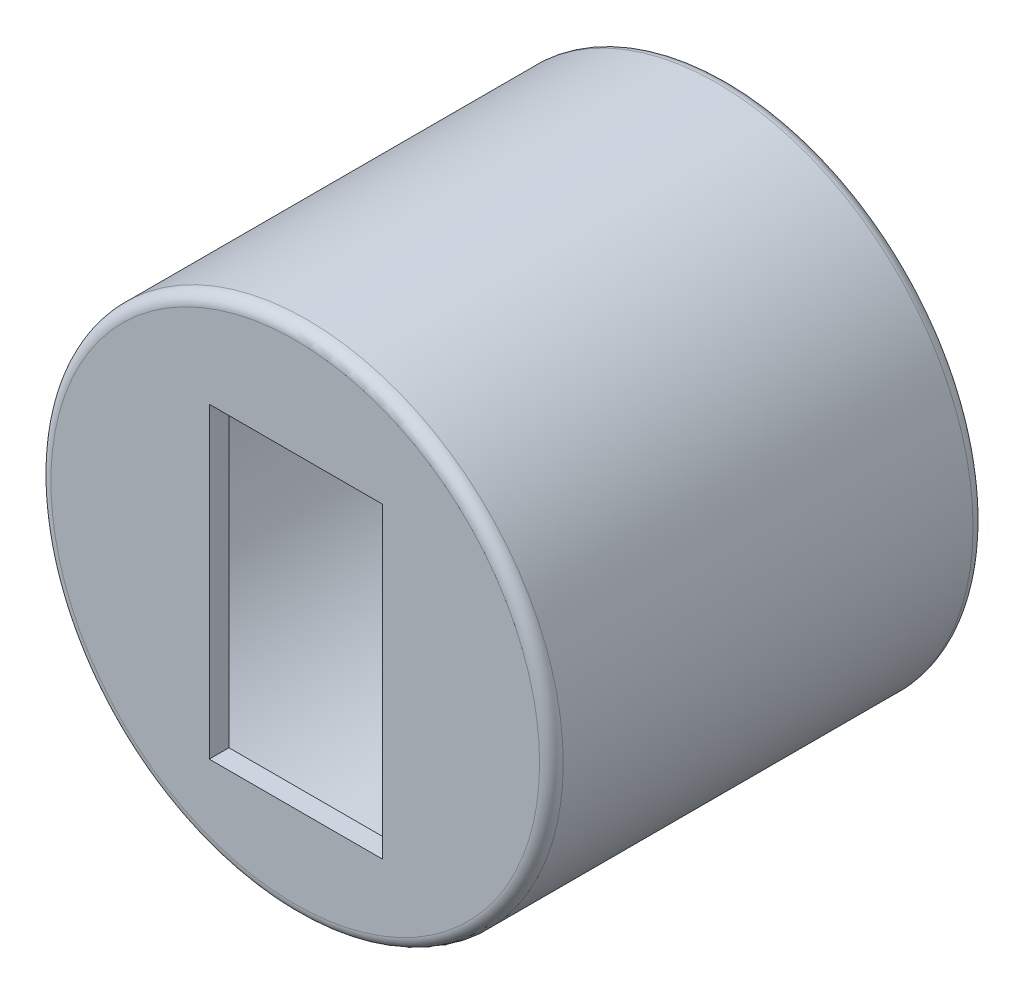
ISO-10303-21;
HEADER;
FILE_DESCRIPTION(('STEP AP214'),'2;1');
FILE_NAME('part.step','',(''),(''),'','','');
FILE_SCHEMA(('AUTOMOTIVE_DESIGN { 1 0 10303 214 1 1 1 1 }'));
ENDSEC;
DATA;
#1=APPLICATION_CONTEXT('core data for automotive mechanical design processes');
#2=APPLICATION_PROTOCOL_DEFINITION('international standard','automotive_design',2000,#1);
#3=PRODUCT_CONTEXT('',#1,'mechanical');
#4=PRODUCT('Part','Part','',(#3));
#5=PRODUCT_RELATED_PRODUCT_CATEGORY('part','',(#4));
#6=PRODUCT_DEFINITION_FORMATION('','',#4);
#7=PRODUCT_DEFINITION_CONTEXT('part definition',#1,'design');
#8=PRODUCT_DEFINITION('design','',#6,#7);
#9=PRODUCT_DEFINITION_SHAPE('','',#8);
#10=(LENGTH_UNIT() NAMED_UNIT(*) SI_UNIT(.MILLI.,.METRE.));
#11=(NAMED_UNIT(*) PLANE_ANGLE_UNIT() SI_UNIT($,.RADIAN.));
#12=(NAMED_UNIT(*) SI_UNIT($,.STERADIAN.) SOLID_ANGLE_UNIT());
#13=UNCERTAINTY_MEASURE_WITH_UNIT(LENGTH_MEASURE(1.E-05),#10,'distance_accuracy_value','');
#14=(GEOMETRIC_REPRESENTATION_CONTEXT(3) GLOBAL_UNCERTAINTY_ASSIGNED_CONTEXT((#13)) GLOBAL_UNIT_ASSIGNED_CONTEXT((#10,
#11,#12)) REPRESENTATION_CONTEXT('',''));
#15=CARTESIAN_POINT('',(0.,0.,0.));
#16=DIRECTION('',(0.,0.,1.));
#17=DIRECTION('',(1.,0.,0.));
#18=AXIS2_PLACEMENT_3D('',#15,#16,#17);
#19=CARTESIAN_POINT('',(0.,0.,10.));
#20=DIRECTION('',(0.,0.,-1.));
#21=DIRECTION('',(-1.,0.,0.));
#22=AXIS2_PLACEMENT_3D('',#19,#20,#21);
#23=CYLINDRICAL_SURFACE('',#22,6.5);
#24=CARTESIAN_POINT('',(0.,0.,-0.200000000000001));
#25=DIRECTION('',(0.,0.,-1.));
#26=DIRECTION('',(-1.,0.,0.));
#27=AXIS2_PLACEMENT_3D('',#24,#25,#26);
#28=CIRCLE('',#27,6.5);
#29=CARTESIAN_POINT('',(-6.5,0.,-0.200000000000001));
#30=VERTEX_POINT('',#29);
#31=EDGE_CURVE('E54',#30,#30,#28,.F.);
#32=ORIENTED_EDGE('',*,*,#31,.T.);
#33=EDGE_LOOP('',(#32));
#34=FACE_BOUND('',#33,.T.);
#35=CARTESIAN_POINT('',(0.,0.,10.2));
#36=DIRECTION('',(0.,0.,1.));
#37=DIRECTION('',(1.,0.,0.));
#38=AXIS2_PLACEMENT_3D('',#35,#36,#37);
#39=CIRCLE('',#38,6.5);
#40=CARTESIAN_POINT('',(6.5,0.,10.2));
#41=VERTEX_POINT('',#40);
#42=EDGE_CURVE('E269',#41,#41,#39,.F.);
#43=ORIENTED_EDGE('',*,*,#42,.T.);
#44=EDGE_LOOP('',(#43));
#45=FACE_BOUND('',#44,.T.);
#46=ADVANCED_FACE('F45',(#34,#45),#23,.T.);
#47=CARTESIAN_POINT('',(0.,0.,-0.5));
#48=DIRECTION('',(0.,0.,-1.));
#49=DIRECTION('',(-1.,0.,0.));
#50=AXIS2_PLACEMENT_3D('',#47,#48,#49);
#51=PLANE('',#50);
#52=CARTESIAN_POINT('',(0.,0.,-0.5));
#53=DIRECTION('',(0.,0.,-1.));
#54=DIRECTION('',(-1.,0.,0.));
#55=AXIS2_PLACEMENT_3D('',#52,#53,#54);
#56=CIRCLE('',#55,6.2);
#57=CARTESIAN_POINT('',(-6.2,0.,-0.5));
#58=VERTEX_POINT('',#57);
#59=EDGE_CURVE('E265',#58,#58,#56,.T.);
#60=ORIENTED_EDGE('',*,*,#59,.T.);
#61=EDGE_LOOP('',(#60));
#62=FACE_BOUND('',#61,.T.);
#63=DIRECTION('',(0.,1.,0.));
#64=VECTOR('',#63,1.);
#65=CARTESIAN_POINT('',(-1.45,1.8,-0.5));
#66=LINE('',#65,#64);
#67=CARTESIAN_POINT('',(-1.45,-1.7,-0.5));
#68=VERTEX_POINT('',#67);
#69=CARTESIAN_POINT('',(-1.45,1.7,-0.5));
#70=VERTEX_POINT('',#69);
#71=EDGE_CURVE('E291',#68,#70,#66,.T.);
#72=ORIENTED_EDGE('',*,*,#71,.F.);
#73=CARTESIAN_POINT('',(-1.35,-1.7,-0.5));
#74=DIRECTION('',(0.,0.,-1.));
#75=DIRECTION('',(-1.,0.,0.));
#76=AXIS2_PLACEMENT_3D('',#73,#74,#75);
#77=CIRCLE('',#76,0.1);
#78=CARTESIAN_POINT('',(-1.35,-1.8,-0.5));
#79=VERTEX_POINT('',#78);
#80=EDGE_CURVE('E242',#68,#79,#77,.F.);
#81=ORIENTED_EDGE('',*,*,#80,.T.);
#82=DIRECTION('',(-1.,0.,0.));
#83=VECTOR('',#82,1.);
#84=CARTESIAN_POINT('',(1.45,-1.8,-0.5));
#85=LINE('',#84,#83);
#86=CARTESIAN_POINT('',(1.35,-1.8,-0.5));
#87=VERTEX_POINT('',#86);
#88=EDGE_CURVE('E177',#87,#79,#85,.T.);
#89=ORIENTED_EDGE('',*,*,#88,.F.);
#90=CARTESIAN_POINT('',(1.35,-1.7,-0.5));
#91=DIRECTION('',(0.,0.,-1.));
#92=DIRECTION('',(-1.,0.,0.));
#93=AXIS2_PLACEMENT_3D('',#90,#91,#92);
#94=CIRCLE('',#93,0.1);
#95=CARTESIAN_POINT('',(1.45,-1.7,-0.5));
#96=VERTEX_POINT('',#95);
#97=EDGE_CURVE('E248',#87,#96,#94,.F.);
#98=ORIENTED_EDGE('',*,*,#97,.T.);
#99=DIRECTION('',(0.,-1.,0.));
#100=VECTOR('',#99,1.);
#101=CARTESIAN_POINT('',(1.45,1.8,-0.5));
#102=LINE('',#101,#100);
#103=CARTESIAN_POINT('',(1.45,1.7,-0.5));
#104=VERTEX_POINT('',#103);
#105=EDGE_CURVE('E301',#104,#96,#102,.T.);
#106=ORIENTED_EDGE('',*,*,#105,.F.);
#107=CARTESIAN_POINT('',(1.35,1.7,-0.5));
#108=DIRECTION('',(0.,0.,-1.));
#109=DIRECTION('',(-1.,0.,0.));
#110=AXIS2_PLACEMENT_3D('',#107,#108,#109);
#111=CIRCLE('',#110,0.1);
#112=CARTESIAN_POINT('',(1.35,1.8,-0.5));
#113=VERTEX_POINT('',#112);
#114=EDGE_CURVE('E254',#104,#113,#111,.F.);
#115=ORIENTED_EDGE('',*,*,#114,.T.);
#116=DIRECTION('',(1.,0.,0.));
#117=VECTOR('',#116,1.);
#118=CARTESIAN_POINT('',(1.45,1.8,-0.5));
#119=LINE('',#118,#117);
#120=CARTESIAN_POINT('',(-1.35,1.8,-0.5));
#121=VERTEX_POINT('',#120);
#122=EDGE_CURVE('E298',#121,#113,#119,.T.);
#123=ORIENTED_EDGE('',*,*,#122,.F.);
#124=CARTESIAN_POINT('',(-1.35,1.7,-0.5));
#125=DIRECTION('',(0.,0.,-1.));
#126=DIRECTION('',(-1.,0.,0.));
#127=AXIS2_PLACEMENT_3D('',#124,#125,#126);
#128=CIRCLE('',#127,0.1);
#129=EDGE_CURVE('E260',#121,#70,#128,.F.);
#130=ORIENTED_EDGE('',*,*,#129,.T.);
#131=EDGE_LOOP('',(#72,#81,#89,#98,#106,#115,#123,#130));
#132=FACE_BOUND('',#131,.T.);
#133=ADVANCED_FACE('F284',(#62,#132),#51,.T.);
#134=CARTESIAN_POINT('',(0.,0.,10.));
#135=DIRECTION('',(0.,0.,1.));
#136=DIRECTION('',(1.,0.,0.));
#137=AXIS2_PLACEMENT_3D('',#134,#135,#136);
#138=PLANE('',#137);
#139=DIRECTION('',(1.,0.,0.));
#140=VECTOR('',#139,1.);
#141=CARTESIAN_POINT('',(2.2181444068749,-4.1,10.));
#142=LINE('',#141,#140);
#143=CARTESIAN_POINT('',(-2.18185559312509,-4.1,10.));
#144=VERTEX_POINT('',#143);
#145=CARTESIAN_POINT('',(2.2181444068749,-4.1,10.));
#146=VERTEX_POINT('',#145);
#147=EDGE_CURVE('E174',#144,#146,#142,.T.);
#148=ORIENTED_EDGE('',*,*,#147,.T.);
#149=DIRECTION('',(0.,1.,0.));
#150=VECTOR('',#149,1.);
#151=CARTESIAN_POINT('',(2.2181444068749,3.7,10.));
#152=LINE('',#151,#150);
#153=CARTESIAN_POINT('',(2.2181444068749,3.7,10.));
#154=VERTEX_POINT('',#153);
#155=EDGE_CURVE('E156',#146,#154,#152,.T.);
#156=ORIENTED_EDGE('',*,*,#155,.T.);
#157=DIRECTION('',(-1.,0.,0.));
#158=VECTOR('',#157,1.);
#159=CARTESIAN_POINT('',(-2.1818555931251,3.7,10.));
#160=LINE('',#159,#158);
#161=CARTESIAN_POINT('',(-2.1818555931251,3.7,10.));
#162=VERTEX_POINT('',#161);
#163=EDGE_CURVE('E180',#154,#162,#160,.T.);
#164=ORIENTED_EDGE('',*,*,#163,.T.);
#165=DIRECTION('',(0.,-1.,0.));
#166=VECTOR('',#165,1.);
#167=CARTESIAN_POINT('',(-2.1818555931251,3.7,10.));
#168=LINE('',#167,#166);
#169=EDGE_CURVE('E150',#162,#144,#168,.T.);
#170=ORIENTED_EDGE('',*,*,#169,.T.);
#171=EDGE_LOOP('',(#148,#156,#164,#170));
#172=FACE_BOUND('',#171,.T.);
#173=CARTESIAN_POINT('',(0.,0.,10.));
#174=DIRECTION('',(0.,0.,1.));
#175=DIRECTION('',(1.,0.,0.));
#176=AXIS2_PLACEMENT_3D('',#173,#174,#175);
#177=CIRCLE('',#176,6.);
#178=CARTESIAN_POINT('',(6.,0.,10.));
#179=VERTEX_POINT('',#178);
#180=EDGE_CURVE('E158',#179,#179,#177,.T.);
#181=ORIENTED_EDGE('',*,*,#180,.F.);
#182=EDGE_LOOP('',(#181));
#183=FACE_BOUND('',#182,.T.);
#184=ADVANCED_FACE('F287',(#172,#183),#138,.F.);
#185=CARTESIAN_POINT('',(0.,0.,10.5));
#186=DIRECTION('',(0.,0.,1.));
#187=DIRECTION('',(1.,0.,0.));
#188=AXIS2_PLACEMENT_3D('',#185,#186,#187);
#189=PLANE('',#188);
#190=CARTESIAN_POINT('',(0.,0.,10.5));
#191=DIRECTION('',(0.,0.,1.));
#192=DIRECTION('',(1.,0.,0.));
#193=AXIS2_PLACEMENT_3D('',#190,#191,#192);
#194=CIRCLE('',#193,6.2);
#195=CARTESIAN_POINT('',(6.2,0.,10.5));
#196=VERTEX_POINT('',#195);
#197=EDGE_CURVE('E11',#196,#196,#194,.T.);
#198=ORIENTED_EDGE('',*,*,#197,.T.);
#199=EDGE_LOOP('',(#198));
#200=FACE_BOUND('',#199,.T.);
#201=DIRECTION('',(0.,1.,0.));
#202=VECTOR('',#201,1.);
#203=CARTESIAN_POINT('',(2.2181444068749,3.7,10.5));
#204=LINE('',#203,#202);
#205=CARTESIAN_POINT('',(2.2181444068749,-4.1,10.5));
#206=VERTEX_POINT('',#205);
#207=CARTESIAN_POINT('',(2.2181444068749,3.7,10.5));
#208=VERTEX_POINT('',#207);
#209=EDGE_CURVE('E149',#206,#208,#204,.T.);
#210=ORIENTED_EDGE('',*,*,#209,.F.);
#211=DIRECTION('',(1.,0.,0.));
#212=VECTOR('',#211,1.);
#213=CARTESIAN_POINT('',(2.2181444068749,-4.1,10.5));
#214=LINE('',#213,#212);
#215=CARTESIAN_POINT('',(-2.18185559312509,-4.1,10.5));
#216=VERTEX_POINT('',#215);
#217=EDGE_CURVE('E138',#216,#206,#214,.T.);
#218=ORIENTED_EDGE('',*,*,#217,.F.);
#219=DIRECTION('',(0.,-1.,0.));
#220=VECTOR('',#219,1.);
#221=CARTESIAN_POINT('',(-2.1818555931251,3.7,10.5));
#222=LINE('',#221,#220);
#223=CARTESIAN_POINT('',(-2.1818555931251,3.7,10.5));
#224=VERTEX_POINT('',#223);
#225=EDGE_CURVE('E168',#224,#216,#222,.T.);
#226=ORIENTED_EDGE('',*,*,#225,.F.);
#227=DIRECTION('',(-1.,0.,0.));
#228=VECTOR('',#227,1.);
#229=CARTESIAN_POINT('',(-2.1818555931251,3.7,10.5));
#230=LINE('',#229,#228);
#231=EDGE_CURVE('E164',#208,#224,#230,.T.);
#232=ORIENTED_EDGE('',*,*,#231,.F.);
#233=EDGE_LOOP('',(#210,#218,#226,#232));
#234=FACE_BOUND('',#233,.T.);
#235=ADVANCED_FACE('F162',(#200,#234),#189,.T.);
#236=CARTESIAN_POINT('',(2.2181444068749,-4.1,10.5));
#237=DIRECTION('',(0.,1.,0.));
#238=DIRECTION('',(0.,0.,1.));
#239=AXIS2_PLACEMENT_3D('',#236,#237,#238);
#240=PLANE('',#239);
#241=ORIENTED_EDGE('',*,*,#147,.F.);
#242=DIRECTION('',(0.,0.,-1.));
#243=VECTOR('',#242,1.);
#244=CARTESIAN_POINT('',(-2.18185559312509,-4.1,10.5));
#245=LINE('',#244,#243);
#246=EDGE_CURVE('E144',#216,#144,#245,.T.);
#247=ORIENTED_EDGE('',*,*,#246,.F.);
#248=ORIENTED_EDGE('',*,*,#217,.T.);
#249=DIRECTION('',(0.,0.,-1.));
#250=VECTOR('',#249,1.);
#251=CARTESIAN_POINT('',(2.2181444068749,-4.1,10.5));
#252=LINE('',#251,#250);
#253=EDGE_CURVE('E141',#206,#146,#252,.T.);
#254=ORIENTED_EDGE('',*,*,#253,.T.);
#255=EDGE_LOOP('',(#241,#247,#248,#254));
#256=FACE_BOUND('',#255,.T.);
#257=ADVANCED_FACE('F140',(#256),#240,.T.);
#258=CARTESIAN_POINT('',(2.2181444068749,3.7,10.5));
#259=DIRECTION('',(-1.,0.,0.));
#260=DIRECTION('',(0.,-1.,0.));
#261=AXIS2_PLACEMENT_3D('',#258,#259,#260);
#262=PLANE('',#261);
#263=ORIENTED_EDGE('',*,*,#155,.F.);
#264=ORIENTED_EDGE('',*,*,#253,.F.);
#265=ORIENTED_EDGE('',*,*,#209,.T.);
#266=DIRECTION('',(0.,0.,-1.));
#267=VECTOR('',#266,1.);
#268=CARTESIAN_POINT('',(2.2181444068749,3.7,10.5));
#269=LINE('',#268,#267);
#270=EDGE_CURVE('E159',#208,#154,#269,.T.);
#271=ORIENTED_EDGE('',*,*,#270,.T.);
#272=EDGE_LOOP('',(#263,#264,#265,#271));
#273=FACE_BOUND('',#272,.T.);
#274=ADVANCED_FACE('F153',(#273),#262,.T.);
#275=CARTESIAN_POINT('',(-2.1818555931251,3.7,10.5));
#276=DIRECTION('',(0.,-1.,0.));
#277=DIRECTION('',(0.,0.,-1.));
#278=AXIS2_PLACEMENT_3D('',#275,#276,#277);
#279=PLANE('',#278);
#280=ORIENTED_EDGE('',*,*,#163,.F.);
#281=ORIENTED_EDGE('',*,*,#270,.F.);
#282=ORIENTED_EDGE('',*,*,#231,.T.);
#283=DIRECTION('',(0.,0.,-1.));
#284=VECTOR('',#283,1.);
#285=CARTESIAN_POINT('',(-2.1818555931251,3.7,10.5));
#286=LINE('',#285,#284);
#287=EDGE_CURVE('E189',#224,#162,#286,.T.);
#288=ORIENTED_EDGE('',*,*,#287,.T.);
#289=EDGE_LOOP('',(#280,#281,#282,#288));
#290=FACE_BOUND('',#289,.T.);
#291=ADVANCED_FACE('F366',(#290),#279,.T.);
#292=CARTESIAN_POINT('',(-2.1818555931251,3.7,10.5));
#293=DIRECTION('',(1.,0.,0.));
#294=DIRECTION('',(0.,1.,0.));
#295=AXIS2_PLACEMENT_3D('',#292,#293,#294);
#296=PLANE('',#295);
#297=ORIENTED_EDGE('',*,*,#169,.F.);
#298=ORIENTED_EDGE('',*,*,#287,.F.);
#299=ORIENTED_EDGE('',*,*,#225,.T.);
#300=ORIENTED_EDGE('',*,*,#246,.T.);
#301=EDGE_LOOP('',(#297,#298,#299,#300));
#302=FACE_BOUND('',#301,.T.);
#303=ADVANCED_FACE('F354',(#302),#296,.T.);
#304=CARTESIAN_POINT('',(0.,0.,0.));
#305=DIRECTION('',(0.,0.,-1.));
#306=DIRECTION('',(-1.,0.,0.));
#307=AXIS2_PLACEMENT_3D('',#304,#305,#306);
#308=PLANE('',#307);
#309=DIRECTION('',(0.,-1.,0.));
#310=VECTOR('',#309,1.);
#311=CARTESIAN_POINT('',(1.45,0.,0.));
#312=LINE('',#311,#310);
#313=CARTESIAN_POINT('',(1.45,1.7,0.));
#314=VERTEX_POINT('',#313);
#315=CARTESIAN_POINT('',(1.45,-1.7,0.));
#316=VERTEX_POINT('',#315);
#317=EDGE_CURVE('E204',#314,#316,#312,.T.);
#318=ORIENTED_EDGE('',*,*,#317,.T.);
#319=CARTESIAN_POINT('',(1.35,-1.7,0.));
#320=DIRECTION('',(0.,0.,-1.));
#321=DIRECTION('',(-1.,0.,0.));
#322=AXIS2_PLACEMENT_3D('',#319,#320,#321);
#323=CIRCLE('',#322,0.1);
#324=CARTESIAN_POINT('',(1.35,-1.8,0.));
#325=VERTEX_POINT('',#324);
#326=EDGE_CURVE('E251',#316,#325,#323,.T.);
#327=ORIENTED_EDGE('',*,*,#326,.T.);
#328=DIRECTION('',(-1.,0.,0.));
#329=VECTOR('',#328,1.);
#330=CARTESIAN_POINT('',(0.,-1.8,0.));
#331=LINE('',#330,#329);
#332=CARTESIAN_POINT('',(-1.35,-1.8,0.));
#333=VERTEX_POINT('',#332);
#334=EDGE_CURVE('E208',#325,#333,#331,.T.);
#335=ORIENTED_EDGE('',*,*,#334,.T.);
#336=CARTESIAN_POINT('',(-1.35,-1.7,0.));
#337=DIRECTION('',(0.,0.,-1.));
#338=DIRECTION('',(-1.,0.,0.));
#339=AXIS2_PLACEMENT_3D('',#336,#337,#338);
#340=CIRCLE('',#339,0.1);
#341=CARTESIAN_POINT('',(-1.45,-1.7,0.));
#342=VERTEX_POINT('',#341);
#343=EDGE_CURVE('E245',#333,#342,#340,.T.);
#344=ORIENTED_EDGE('',*,*,#343,.T.);
#345=DIRECTION('',(0.,1.,0.));
#346=VECTOR('',#345,1.);
#347=CARTESIAN_POINT('',(-1.45,0.,0.));
#348=LINE('',#347,#346);
#349=CARTESIAN_POINT('',(-1.45,1.7,0.));
#350=VERTEX_POINT('',#349);
#351=EDGE_CURVE('E212',#342,#350,#348,.T.);
#352=ORIENTED_EDGE('',*,*,#351,.T.);
#353=CARTESIAN_POINT('',(-1.35,1.7,0.));
#354=DIRECTION('',(0.,0.,-1.));
#355=DIRECTION('',(-1.,0.,0.));
#356=AXIS2_PLACEMENT_3D('',#353,#354,#355);
#357=CIRCLE('',#356,0.1);
#358=CARTESIAN_POINT('',(-1.35,1.8,0.));
#359=VERTEX_POINT('',#358);
#360=EDGE_CURVE('E68',#350,#359,#357,.T.);
#361=ORIENTED_EDGE('',*,*,#360,.T.);
#362=DIRECTION('',(1.,0.,0.));
#363=VECTOR('',#362,1.);
#364=CARTESIAN_POINT('',(0.,1.8,0.));
#365=LINE('',#364,#363);
#366=CARTESIAN_POINT('',(1.35,1.8,0.));
#367=VERTEX_POINT('',#366);
#368=EDGE_CURVE('E201',#359,#367,#365,.T.);
#369=ORIENTED_EDGE('',*,*,#368,.T.);
#370=CARTESIAN_POINT('',(1.35,1.7,0.));
#371=DIRECTION('',(0.,0.,-1.));
#372=DIRECTION('',(-1.,0.,0.));
#373=AXIS2_PLACEMENT_3D('',#370,#371,#372);
#374=CIRCLE('',#373,0.1);
#375=EDGE_CURVE('E257',#367,#314,#374,.T.);
#376=ORIENTED_EDGE('',*,*,#375,.T.);
#377=EDGE_LOOP('',(#318,#327,#335,#344,#352,#361,#369,#376));
#378=FACE_BOUND('',#377,.T.);
#379=CARTESIAN_POINT('',(0.,0.,0.));
#380=DIRECTION('',(0.,0.,1.));
#381=DIRECTION('',(1.,0.,0.));
#382=AXIS2_PLACEMENT_3D('',#379,#380,#381);
#383=CIRCLE('',#382,6.);
#384=CARTESIAN_POINT('',(6.,0.,0.));
#385=VERTEX_POINT('',#384);
#386=EDGE_CURVE('E197',#385,#385,#383,.T.);
#387=ORIENTED_EDGE('',*,*,#386,.T.);
#388=EDGE_LOOP('',(#387));
#389=FACE_BOUND('',#388,.T.);
#390=ADVANCED_FACE('F317',(#378,#389),#308,.F.);
#391=CARTESIAN_POINT('',(0.,0.,10.));
#392=DIRECTION('',(0.,0.,-1.));
#393=DIRECTION('',(-1.,0.,0.));
#394=AXIS2_PLACEMENT_3D('',#391,#392,#393);
#395=CYLINDRICAL_SURFACE('',#394,6.);
#396=ORIENTED_EDGE('',*,*,#180,.T.);
#397=EDGE_LOOP('',(#396));
#398=FACE_BOUND('',#397,.T.);
#399=ORIENTED_EDGE('',*,*,#386,.F.);
#400=EDGE_LOOP('',(#399));
#401=FACE_BOUND('',#400,.T.);
#402=ADVANCED_FACE('F349',(#398,#401),#395,.F.);
#403=CARTESIAN_POINT('',(-1.45,1.8,0.5));
#404=DIRECTION('',(-1.,0.,0.));
#405=DIRECTION('',(0.,-1.,0.));
#406=AXIS2_PLACEMENT_3D('',#403,#404,#405);
#407=PLANE('',#406);
#408=ORIENTED_EDGE('',*,*,#351,.F.);
#409=DIRECTION('',(0.,0.,-1.));
#410=VECTOR('',#409,1.);
#411=CARTESIAN_POINT('',(-1.45,-1.7,-0.5));
#412=LINE('',#411,#410);
#413=EDGE_CURVE('E218',#342,#68,#412,.T.);
#414=ORIENTED_EDGE('',*,*,#413,.T.);
#415=ORIENTED_EDGE('',*,*,#71,.T.);
#416=DIRECTION('',(0.,0.,-1.));
#417=VECTOR('',#416,1.);
#418=CARTESIAN_POINT('',(-1.45,1.7,0.));
#419=LINE('',#418,#417);
#420=EDGE_CURVE('E215',#70,#350,#419,.F.);
#421=ORIENTED_EDGE('',*,*,#420,.T.);
#422=EDGE_LOOP('',(#408,#414,#415,#421));
#423=FACE_BOUND('',#422,.T.);
#424=ADVANCED_FACE('F319',(#423),#407,.F.);
#425=CARTESIAN_POINT('',(1.45,-1.8,0.5));
#426=DIRECTION('',(0.,-1.,0.));
#427=DIRECTION('',(0.,0.,-1.));
#428=AXIS2_PLACEMENT_3D('',#425,#426,#427);
#429=PLANE('',#428);
#430=ORIENTED_EDGE('',*,*,#88,.T.);
#431=DIRECTION('',(0.,0.,-1.));
#432=VECTOR('',#431,1.);
#433=CARTESIAN_POINT('',(-1.35,-1.8,0.));
#434=LINE('',#433,#432);
#435=EDGE_CURVE('E226',#79,#333,#434,.F.);
#436=ORIENTED_EDGE('',*,*,#435,.T.);
#437=ORIENTED_EDGE('',*,*,#334,.F.);
#438=DIRECTION('',(0.,0.,-1.));
#439=VECTOR('',#438,1.);
#440=CARTESIAN_POINT('',(1.35,-1.8,-0.5));
#441=LINE('',#440,#439);
#442=EDGE_CURVE('E222',#325,#87,#441,.T.);
#443=ORIENTED_EDGE('',*,*,#442,.T.);
#444=EDGE_LOOP('',(#430,#436,#437,#443));
#445=FACE_BOUND('',#444,.T.);
#446=ADVANCED_FACE('F309',(#445),#429,.F.);
#447=CARTESIAN_POINT('',(1.45,1.8,0.5));
#448=DIRECTION('',(1.,0.,0.));
#449=DIRECTION('',(0.,1.,0.));
#450=AXIS2_PLACEMENT_3D('',#447,#448,#449);
#451=PLANE('',#450);
#452=ORIENTED_EDGE('',*,*,#105,.T.);
#453=DIRECTION('',(0.,0.,-1.));
#454=VECTOR('',#453,1.);
#455=CARTESIAN_POINT('',(1.45,-1.7,0.));
#456=LINE('',#455,#454);
#457=EDGE_CURVE('E233',#96,#316,#456,.F.);
#458=ORIENTED_EDGE('',*,*,#457,.T.);
#459=ORIENTED_EDGE('',*,*,#317,.F.);
#460=DIRECTION('',(0.,0.,-1.));
#461=VECTOR('',#460,1.);
#462=CARTESIAN_POINT('',(1.45,1.7,-0.5));
#463=LINE('',#462,#461);
#464=EDGE_CURVE('E229',#314,#104,#463,.T.);
#465=ORIENTED_EDGE('',*,*,#464,.T.);
#466=EDGE_LOOP('',(#452,#458,#459,#465));
#467=FACE_BOUND('',#466,.T.);
#468=ADVANCED_FACE('F330',(#467),#451,.F.);
#469=CARTESIAN_POINT('',(1.45,1.8,0.5));
#470=DIRECTION('',(0.,1.,0.));
#471=DIRECTION('',(0.,0.,1.));
#472=AXIS2_PLACEMENT_3D('',#469,#470,#471);
#473=PLANE('',#472);
#474=ORIENTED_EDGE('',*,*,#122,.T.);
#475=DIRECTION('',(0.,0.,-1.));
#476=VECTOR('',#475,1.);
#477=CARTESIAN_POINT('',(1.35,1.8,0.));
#478=LINE('',#477,#476);
#479=EDGE_CURVE('E61',#113,#367,#478,.F.);
#480=ORIENTED_EDGE('',*,*,#479,.T.);
#481=ORIENTED_EDGE('',*,*,#368,.F.);
#482=DIRECTION('',(0.,0.,-1.));
#483=VECTOR('',#482,1.);
#484=CARTESIAN_POINT('',(-1.35,1.8,-0.5));
#485=LINE('',#484,#483);
#486=EDGE_CURVE('E236',#359,#121,#485,.T.);
#487=ORIENTED_EDGE('',*,*,#486,.T.);
#488=EDGE_LOOP('',(#474,#480,#481,#487));
#489=FACE_BOUND('',#488,.T.);
#490=ADVANCED_FACE('F322',(#489),#473,.F.);
#491=CARTESIAN_POINT('',(-1.35,-1.7,0.5));
#492=DIRECTION('',(0.,0.,1.));
#493=DIRECTION('',(1.,0.,0.));
#494=AXIS2_PLACEMENT_3D('',#491,#492,#493);
#495=CYLINDRICAL_SURFACE('',#494,0.1);
#496=ORIENTED_EDGE('',*,*,#343,.F.);
#497=ORIENTED_EDGE('',*,*,#435,.F.);
#498=ORIENTED_EDGE('',*,*,#80,.F.);
#499=ORIENTED_EDGE('',*,*,#413,.F.);
#500=EDGE_LOOP('',(#496,#497,#498,#499));
#501=FACE_BOUND('',#500,.T.);
#502=ADVANCED_FACE('F314',(#501),#495,.F.);
#503=CARTESIAN_POINT('',(1.35,-1.7,0.5));
#504=DIRECTION('',(0.,0.,1.));
#505=DIRECTION('',(1.,0.,0.));
#506=AXIS2_PLACEMENT_3D('',#503,#504,#505);
#507=CYLINDRICAL_SURFACE('',#506,0.1);
#508=ORIENTED_EDGE('',*,*,#326,.F.);
#509=ORIENTED_EDGE('',*,*,#457,.F.);
#510=ORIENTED_EDGE('',*,*,#97,.F.);
#511=ORIENTED_EDGE('',*,*,#442,.F.);
#512=EDGE_LOOP('',(#508,#509,#510,#511));
#513=FACE_BOUND('',#512,.T.);
#514=ADVANCED_FACE('F334',(#513),#507,.F.);
#515=CARTESIAN_POINT('',(1.35,1.7,0.5));
#516=DIRECTION('',(0.,0.,1.));
#517=DIRECTION('',(1.,0.,0.));
#518=AXIS2_PLACEMENT_3D('',#515,#516,#517);
#519=CYLINDRICAL_SURFACE('',#518,0.1);
#520=ORIENTED_EDGE('',*,*,#375,.F.);
#521=ORIENTED_EDGE('',*,*,#479,.F.);
#522=ORIENTED_EDGE('',*,*,#114,.F.);
#523=ORIENTED_EDGE('',*,*,#464,.F.);
#524=EDGE_LOOP('',(#520,#521,#522,#523));
#525=FACE_BOUND('',#524,.T.);
#526=ADVANCED_FACE('F327',(#525),#519,.F.);
#527=CARTESIAN_POINT('',(-1.35,1.7,0.5));
#528=DIRECTION('',(0.,0.,1.));
#529=DIRECTION('',(1.,0.,0.));
#530=AXIS2_PLACEMENT_3D('',#527,#528,#529);
#531=CYLINDRICAL_SURFACE('',#530,0.1);
#532=ORIENTED_EDGE('',*,*,#360,.F.);
#533=ORIENTED_EDGE('',*,*,#420,.F.);
#534=ORIENTED_EDGE('',*,*,#129,.F.);
#535=ORIENTED_EDGE('',*,*,#486,.F.);
#536=EDGE_LOOP('',(#532,#533,#534,#535));
#537=FACE_BOUND('',#536,.T.);
#538=ADVANCED_FACE('F281',(#537),#531,.F.);
#539=CARTESIAN_POINT('',(0.,0.,-0.200000000000001));
#540=DIRECTION('',(0.,0.,-1.));
#541=DIRECTION('',(-1.,0.,0.));
#542=AXIS2_PLACEMENT_3D('',#539,#540,#541);
#543=TOROIDAL_SURFACE('',#542,6.2,0.3);
#544=ORIENTED_EDGE('',*,*,#31,.F.);
#545=EDGE_LOOP('',(#544));
#546=FACE_BOUND('',#545,.T.);
#547=ORIENTED_EDGE('',*,*,#59,.F.);
#548=EDGE_LOOP('',(#547));
#549=FACE_BOUND('',#548,.T.);
#550=ADVANCED_FACE('F278',(#546,#549),#543,.T.);
#551=CARTESIAN_POINT('',(0.,0.,10.2));
#552=DIRECTION('',(0.,0.,1.));
#553=DIRECTION('',(1.,0.,0.));
#554=AXIS2_PLACEMENT_3D('',#551,#552,#553);
#555=TOROIDAL_SURFACE('',#554,6.2,0.3);
#556=ORIENTED_EDGE('',*,*,#42,.F.);
#557=EDGE_LOOP('',(#556));
#558=FACE_BOUND('',#557,.T.);
#559=ORIENTED_EDGE('',*,*,#197,.F.);
#560=EDGE_LOOP('',(#559));
#561=FACE_BOUND('',#560,.T.);
#562=ADVANCED_FACE('F47',(#558,#561),#555,.T.);
#563=CLOSED_SHELL('',(#46,#133,#184,#235,#257,#274,#291,#303,#390,#402,#424,#446,#468,#490,#502,
#514,#526,#538,#550,#562));
#564=MANIFOLD_SOLID_BREP('B2',#563);
#565=ADVANCED_BREP_SHAPE_REPRESENTATION('',(#18,#564),#14);
#566=SHAPE_DEFINITION_REPRESENTATION(#9,#565);
ENDSEC;
END-ISO-10303-21;
